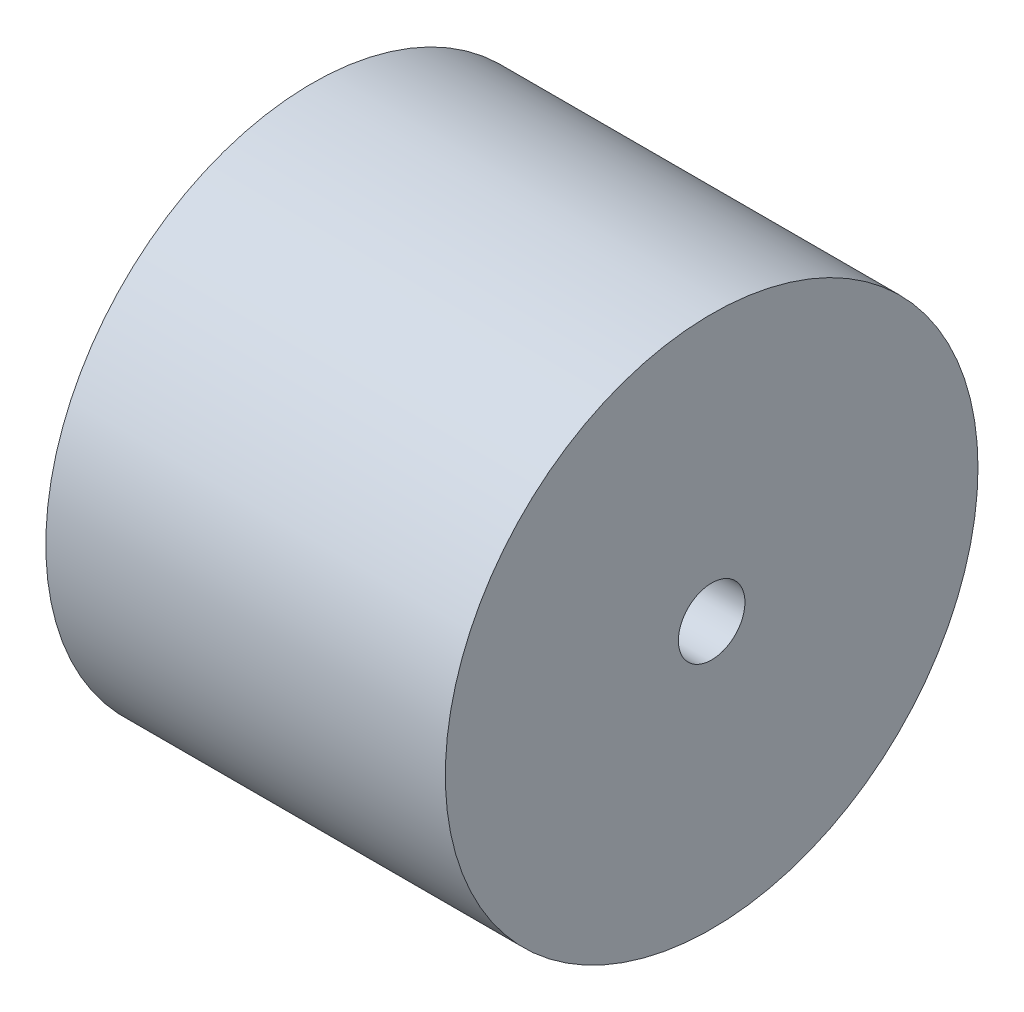
ISO-10303-21;
HEADER;
FILE_DESCRIPTION(('STEP AP214'),'2;1');
FILE_NAME('part.step','',(''),(''),'','','');
FILE_SCHEMA(('AUTOMOTIVE_DESIGN { 1 0 10303 214 1 1 1 1 }'));
ENDSEC;
DATA;
#1=APPLICATION_CONTEXT('core data for automotive mechanical design processes');
#2=APPLICATION_PROTOCOL_DEFINITION('international standard','automotive_design',2000,#1);
#3=PRODUCT_CONTEXT('',#1,'mechanical');
#4=PRODUCT('Part','Part','',(#3));
#5=PRODUCT_RELATED_PRODUCT_CATEGORY('part','',(#4));
#6=PRODUCT_DEFINITION_FORMATION('','',#4);
#7=PRODUCT_DEFINITION_CONTEXT('part definition',#1,'design');
#8=PRODUCT_DEFINITION('design','',#6,#7);
#9=PRODUCT_DEFINITION_SHAPE('','',#8);
#10=(LENGTH_UNIT() NAMED_UNIT(*) SI_UNIT(.MILLI.,.METRE.));
#11=(NAMED_UNIT(*) PLANE_ANGLE_UNIT() SI_UNIT($,.RADIAN.));
#12=(NAMED_UNIT(*) SI_UNIT($,.STERADIAN.) SOLID_ANGLE_UNIT());
#13=UNCERTAINTY_MEASURE_WITH_UNIT(LENGTH_MEASURE(1.E-05),#10,'distance_accuracy_value','');
#14=(GEOMETRIC_REPRESENTATION_CONTEXT(3) GLOBAL_UNCERTAINTY_ASSIGNED_CONTEXT((#13)) GLOBAL_UNIT_ASSIGNED_CONTEXT((#10,
#11,#12)) REPRESENTATION_CONTEXT('',''));
#15=CARTESIAN_POINT('',(0.,0.,0.));
#16=DIRECTION('',(0.,0.,1.));
#17=DIRECTION('',(1.,0.,0.));
#18=AXIS2_PLACEMENT_3D('',#15,#16,#17);
#19=CARTESIAN_POINT('',(-15.,4.,0.));
#20=DIRECTION('',(-1.,0.,0.));
#21=DIRECTION('',(0.,0.,1.));
#22=AXIS2_PLACEMENT_3D('',#19,#20,#21);
#23=PLANE('',#22);
#24=CARTESIAN_POINT('',(-15.,0.,0.));
#25=DIRECTION('',(1.,0.,0.));
#26=DIRECTION('',(0.,0.,-1.));
#27=AXIS2_PLACEMENT_3D('',#24,#25,#26);
#28=CIRCLE('',#27,4.);
#29=CARTESIAN_POINT('',(-15.,0.,-4.));
#30=VERTEX_POINT('',#29);
#31=EDGE_CURVE('E11',#30,#30,#28,.T.);
#32=ORIENTED_EDGE('',*,*,#31,.F.);
#33=EDGE_LOOP('',(#32));
#34=FACE_BOUND('',#33,.T.);
#35=ADVANCED_FACE('F35',(#34),#23,.T.);
#36=CARTESIAN_POINT('',(-19.4651427748729,0.,0.));
#37=DIRECTION('',(1.,0.,0.));
#38=DIRECTION('',(0.,0.,-1.));
#39=AXIS2_PLACEMENT_3D('',#36,#37,#38);
#40=TOROIDAL_SURFACE('',#39,6.25,5.);
#41=ORIENTED_EDGE('',*,*,#31,.T.);
#42=EDGE_LOOP('',(#41));
#43=FACE_BOUND('',#42,.T.);
#44=CARTESIAN_POINT('',(-15.,0.,0.));
#45=DIRECTION('',(1.,0.,0.));
#46=DIRECTION('',(0.,0.,-1.));
#47=AXIS2_PLACEMENT_3D('',#44,#45,#46);
#48=CIRCLE('',#47,8.5);
#49=CARTESIAN_POINT('',(-15.,0.,-8.5));
#50=VERTEX_POINT('',#49);
#51=EDGE_CURVE('E41',#50,#50,#48,.T.);
#52=ORIENTED_EDGE('',*,*,#51,.F.);
#53=EDGE_LOOP('',(#52));
#54=FACE_BOUND('',#53,.T.);
#55=ADVANCED_FACE('F70',(#43,#54),#40,.F.);
#56=CARTESIAN_POINT('',(-15.,10.,0.));
#57=DIRECTION('',(-1.,0.,0.));
#58=DIRECTION('',(0.,0.,1.));
#59=AXIS2_PLACEMENT_3D('',#56,#57,#58);
#60=PLANE('',#59);
#61=ORIENTED_EDGE('',*,*,#51,.T.);
#62=EDGE_LOOP('',(#61));
#63=FACE_BOUND('',#62,.T.);
#64=CARTESIAN_POINT('',(-15.,0.,0.));
#65=DIRECTION('',(1.,0.,0.));
#66=DIRECTION('',(0.,0.,-1.));
#67=AXIS2_PLACEMENT_3D('',#64,#65,#66);
#68=CIRCLE('',#67,10.);
#69=CARTESIAN_POINT('',(-15.,0.,-10.));
#70=VERTEX_POINT('',#69);
#71=EDGE_CURVE('E58',#70,#70,#68,.T.);
#72=ORIENTED_EDGE('',*,*,#71,.F.);
#73=EDGE_LOOP('',(#72));
#74=FACE_BOUND('',#73,.T.);
#75=ADVANCED_FACE('F67',(#63,#74),#60,.T.);
#76=CARTESIAN_POINT('',(0.,0.,0.));
#77=DIRECTION('',(1.,0.,0.));
#78=DIRECTION('',(0.,0.,-1.));
#79=AXIS2_PLACEMENT_3D('',#76,#77,#78);
#80=CYLINDRICAL_SURFACE('',#79,10.);
#81=ORIENTED_EDGE('',*,*,#71,.T.);
#82=EDGE_LOOP('',(#81));
#83=FACE_BOUND('',#82,.T.);
#84=CARTESIAN_POINT('',(0.,0.,0.));
#85=DIRECTION('',(1.,0.,0.));
#86=DIRECTION('',(0.,0.,-1.));
#87=AXIS2_PLACEMENT_3D('',#84,#85,#86);
#88=CIRCLE('',#87,10.);
#89=CARTESIAN_POINT('',(0.,0.,-10.));
#90=VERTEX_POINT('',#89);
#91=EDGE_CURVE('E54',#90,#90,#88,.T.);
#92=ORIENTED_EDGE('',*,*,#91,.F.);
#93=EDGE_LOOP('',(#92));
#94=FACE_BOUND('',#93,.T.);
#95=ADVANCED_FACE('F77',(#83,#94),#80,.T.);
#96=CARTESIAN_POINT('',(0.,0.,0.));
#97=DIRECTION('',(1.,0.,0.));
#98=DIRECTION('',(0.,0.,-1.));
#99=AXIS2_PLACEMENT_3D('',#96,#97,#98);
#100=PLANE('',#99);
#101=CARTESIAN_POINT('',(0.,0.,0.));
#102=DIRECTION('',(1.,0.,0.));
#103=DIRECTION('',(0.,0.,-1.));
#104=AXIS2_PLACEMENT_3D('',#101,#102,#103);
#105=CIRCLE('',#104,1.25);
#106=CARTESIAN_POINT('',(0.,0.,-1.25));
#107=VERTEX_POINT('',#106);
#108=EDGE_CURVE('E55',#107,#107,#105,.T.);
#109=ORIENTED_EDGE('',*,*,#108,.F.);
#110=EDGE_LOOP('',(#109));
#111=FACE_BOUND('',#110,.T.);
#112=ORIENTED_EDGE('',*,*,#91,.T.);
#113=EDGE_LOOP('',(#112));
#114=FACE_BOUND('',#113,.T.);
#115=ADVANCED_FACE('F48',(#111,#114),#100,.T.);
#116=CARTESIAN_POINT('',(-7.5,0.,0.));
#117=DIRECTION('',(1.,0.,0.));
#118=DIRECTION('',(0.,0.,-1.));
#119=AXIS2_PLACEMENT_3D('',#116,#117,#118);
#120=CONICAL_SURFACE('',#119,1.25,1.02974425867665);
#121=CARTESIAN_POINT('',(-8.25107577378445,0.,0.));
#122=VERTEX_POINT('',#121);
#123=VERTEX_LOOP('',#122);
#124=FACE_BOUND('',#123,.T.);
#125=CARTESIAN_POINT('',(-7.5,0.,0.));
#126=DIRECTION('',(1.,0.,0.));
#127=DIRECTION('',(0.,0.,-1.));
#128=AXIS2_PLACEMENT_3D('',#125,#126,#127);
#129=CIRCLE('',#128,1.25);
#130=CARTESIAN_POINT('',(-7.5,0.,-1.25));
#131=VERTEX_POINT('',#130);
#132=EDGE_CURVE('E52',#131,#131,#129,.T.);
#133=ORIENTED_EDGE('',*,*,#132,.T.);
#134=EDGE_LOOP('',(#133));
#135=FACE_BOUND('',#134,.T.);
#136=ADVANCED_FACE('F44',(#124,#135),#120,.F.);
#137=CARTESIAN_POINT('',(0.,0.,0.));
#138=DIRECTION('',(1.,0.,0.));
#139=DIRECTION('',(0.,0.,-1.));
#140=AXIS2_PLACEMENT_3D('',#137,#138,#139);
#141=CYLINDRICAL_SURFACE('',#140,1.25);
#142=ORIENTED_EDGE('',*,*,#132,.F.);
#143=EDGE_LOOP('',(#142));
#144=FACE_BOUND('',#143,.T.);
#145=ORIENTED_EDGE('',*,*,#108,.T.);
#146=EDGE_LOOP('',(#145));
#147=FACE_BOUND('',#146,.T.);
#148=ADVANCED_FACE('F47',(#144,#147),#141,.F.);
#149=CLOSED_SHELL('',(#35,#55,#75,#95,#115,#136,#148));
#150=MANIFOLD_SOLID_BREP('B2',#149);
#151=ADVANCED_BREP_SHAPE_REPRESENTATION('',(#18,#150),#14);
#152=SHAPE_DEFINITION_REPRESENTATION(#9,#151);
ENDSEC;
END-ISO-10303-21;
